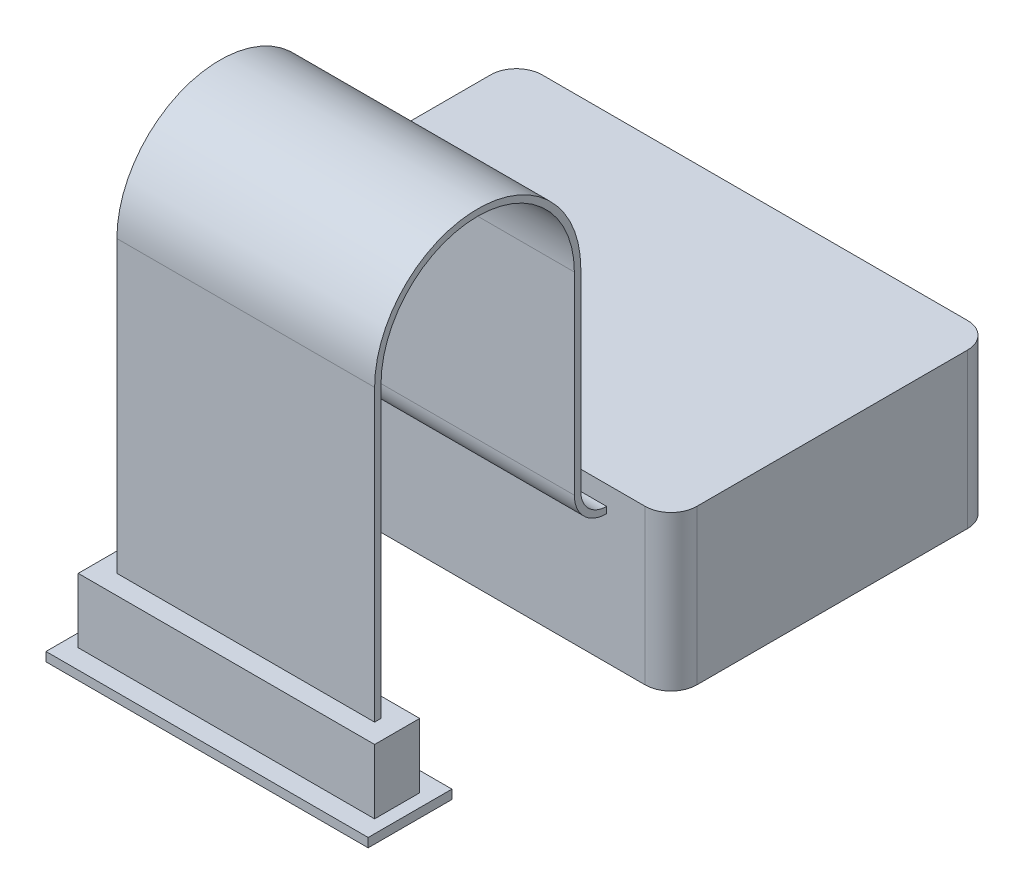
ISO-10303-21;
HEADER;
FILE_DESCRIPTION(('STEP AP214'),'2;1');
FILE_NAME('part.step','',(''),(''),'','','');
FILE_SCHEMA(('AUTOMOTIVE_DESIGN { 1 0 10303 214 1 1 1 1 }'));
ENDSEC;
DATA;
#1=APPLICATION_CONTEXT('core data for automotive mechanical design processes');
#2=APPLICATION_PROTOCOL_DEFINITION('international standard','automotive_design',2000,#1);
#3=PRODUCT_CONTEXT('',#1,'mechanical');
#4=PRODUCT('Part','Part','',(#3));
#5=PRODUCT_RELATED_PRODUCT_CATEGORY('part','',(#4));
#6=PRODUCT_DEFINITION_FORMATION('','',#4);
#7=PRODUCT_DEFINITION_CONTEXT('part definition',#1,'design');
#8=PRODUCT_DEFINITION('design','',#6,#7);
#9=PRODUCT_DEFINITION_SHAPE('','',#8);
#10=(LENGTH_UNIT() NAMED_UNIT(*) SI_UNIT(.MILLI.,.METRE.));
#11=(NAMED_UNIT(*) PLANE_ANGLE_UNIT() SI_UNIT($,.RADIAN.));
#12=(NAMED_UNIT(*) SI_UNIT($,.STERADIAN.) SOLID_ANGLE_UNIT());
#13=UNCERTAINTY_MEASURE_WITH_UNIT(LENGTH_MEASURE(1.E-05),#10,'distance_accuracy_value','');
#14=(GEOMETRIC_REPRESENTATION_CONTEXT(3) GLOBAL_UNCERTAINTY_ASSIGNED_CONTEXT((#13)) GLOBAL_UNIT_ASSIGNED_CONTEXT((#10,
#11,#12)) REPRESENTATION_CONTEXT('',''));
#15=CARTESIAN_POINT('',(0.,0.,0.));
#16=DIRECTION('',(0.,0.,1.));
#17=DIRECTION('',(1.,0.,0.));
#18=AXIS2_PLACEMENT_3D('',#15,#16,#17);
#19=CARTESIAN_POINT('',(-46.99,30.48,31.75));
#20=DIRECTION('',(0.,0.,-1.));
#21=DIRECTION('',(-1.,0.,0.));
#22=AXIS2_PLACEMENT_3D('',#19,#20,#21);
#23=PLANE('',#22);
#24=DIRECTION('',(1.,0.,0.));
#25=VECTOR('',#24,1.);
#26=CARTESIAN_POINT('',(-46.99,0.,31.75));
#27=LINE('',#26,#25);
#28=CARTESIAN_POINT('',(-41.91,0.,31.75));
#29=VERTEX_POINT('',#28);
#30=CARTESIAN_POINT('',(41.91,0.,31.75));
#31=VERTEX_POINT('',#30);
#32=EDGE_CURVE('E349',#29,#31,#27,.T.);
#33=ORIENTED_EDGE('',*,*,#32,.T.);
#34=DIRECTION('',(0.,-1.,0.));
#35=VECTOR('',#34,1.);
#36=CARTESIAN_POINT('',(41.91,30.48,31.75));
#37=LINE('',#36,#35);
#38=CARTESIAN_POINT('',(41.91,30.48,31.75));
#39=VERTEX_POINT('',#38);
#40=EDGE_CURVE('E43',#31,#39,#37,.F.);
#41=ORIENTED_EDGE('',*,*,#40,.T.);
#42=DIRECTION('',(1.,0.,0.));
#43=VECTOR('',#42,1.);
#44=CARTESIAN_POINT('',(-46.99,30.48,31.75));
#45=LINE('',#44,#43);
#46=CARTESIAN_POINT('',(-41.91,30.48,31.75));
#47=VERTEX_POINT('',#46);
#48=EDGE_CURVE('E355',#47,#39,#45,.T.);
#49=ORIENTED_EDGE('',*,*,#48,.F.);
#50=DIRECTION('',(0.,-1.,0.));
#51=VECTOR('',#50,1.);
#52=CARTESIAN_POINT('',(-41.91,30.48,31.75));
#53=LINE('',#52,#51);
#54=EDGE_CURVE('E399',#47,#29,#53,.T.);
#55=ORIENTED_EDGE('',*,*,#54,.T.);
#56=EDGE_LOOP('',(#33,#41,#49,#55));
#57=FACE_BOUND('',#56,.T.);
#58=DIRECTION('',(0.,1.,0.));
#59=VECTOR('',#58,1.);
#60=CARTESIAN_POINT('',(-16.51,26.67,31.75));
#61=LINE('',#60,#59);
#62=CARTESIAN_POINT('',(-16.51,25.4,31.75));
#63=VERTEX_POINT('',#62);
#64=CARTESIAN_POINT('',(-16.51,26.67,31.75));
#65=VERTEX_POINT('',#64);
#66=EDGE_CURVE('E280',#63,#65,#61,.T.);
#67=ORIENTED_EDGE('',*,*,#66,.T.);
#68=DIRECTION('',(1.,0.,0.));
#69=VECTOR('',#68,1.);
#70=CARTESIAN_POINT('',(-16.51,26.67,31.75));
#71=LINE('',#70,#69);
#72=CARTESIAN_POINT('',(34.29,26.67,31.75));
#73=VERTEX_POINT('',#72);
#74=EDGE_CURVE('E340',#65,#73,#71,.T.);
#75=ORIENTED_EDGE('',*,*,#74,.T.);
#76=DIRECTION('',(0.,1.,0.));
#77=VECTOR('',#76,1.);
#78=CARTESIAN_POINT('',(34.29,26.67,31.75));
#79=LINE('',#78,#77);
#80=CARTESIAN_POINT('',(34.29,25.4,31.75));
#81=VERTEX_POINT('',#80);
#82=EDGE_CURVE('E305',#81,#73,#79,.T.);
#83=ORIENTED_EDGE('',*,*,#82,.F.);
#84=DIRECTION('',(1.,0.,0.));
#85=VECTOR('',#84,1.);
#86=CARTESIAN_POINT('',(-16.51,25.4,31.75));
#87=LINE('',#86,#85);
#88=EDGE_CURVE('E303',#63,#81,#87,.T.);
#89=ORIENTED_EDGE('',*,*,#88,.F.);
#90=EDGE_LOOP('',(#67,#75,#83,#89));
#91=FACE_BOUND('',#90,.T.);
#92=ADVANCED_FACE('F35',(#57,#91),#23,.F.);
#93=CARTESIAN_POINT('',(46.99,30.48,-31.75));
#94=DIRECTION('',(-1.,0.,0.));
#95=DIRECTION('',(0.,0.,1.));
#96=AXIS2_PLACEMENT_3D('',#93,#94,#95);
#97=PLANE('',#96);
#98=DIRECTION('',(0.,0.,-1.));
#99=VECTOR('',#98,1.);
#100=CARTESIAN_POINT('',(46.99,0.,-31.75));
#101=LINE('',#100,#99);
#102=CARTESIAN_POINT('',(46.99,0.,26.67));
#103=VERTEX_POINT('',#102);
#104=CARTESIAN_POINT('',(46.99,0.,-26.67));
#105=VERTEX_POINT('',#104);
#106=EDGE_CURVE('E328',#103,#105,#101,.T.);
#107=ORIENTED_EDGE('',*,*,#106,.T.);
#108=DIRECTION('',(0.,-1.,0.));
#109=VECTOR('',#108,1.);
#110=CARTESIAN_POINT('',(46.99,30.48,-26.67));
#111=LINE('',#110,#109);
#112=CARTESIAN_POINT('',(46.99,30.48,-26.67));
#113=VERTEX_POINT('',#112);
#114=EDGE_CURVE('E397',#105,#113,#111,.F.);
#115=ORIENTED_EDGE('',*,*,#114,.T.);
#116=DIRECTION('',(0.,0.,-1.));
#117=VECTOR('',#116,1.);
#118=CARTESIAN_POINT('',(46.99,30.48,-31.75));
#119=LINE('',#118,#117);
#120=CARTESIAN_POINT('',(46.99,30.48,26.67));
#121=VERTEX_POINT('',#120);
#122=EDGE_CURVE('E345',#121,#113,#119,.T.);
#123=ORIENTED_EDGE('',*,*,#122,.F.);
#124=DIRECTION('',(0.,-1.,0.));
#125=VECTOR('',#124,1.);
#126=CARTESIAN_POINT('',(46.99,30.48,26.67));
#127=LINE('',#126,#125);
#128=EDGE_CURVE('E394',#121,#103,#127,.T.);
#129=ORIENTED_EDGE('',*,*,#128,.T.);
#130=EDGE_LOOP('',(#107,#115,#123,#129));
#131=FACE_BOUND('',#130,.T.);
#132=ADVANCED_FACE('F417',(#131),#97,.F.);
#133=CARTESIAN_POINT('',(-46.99,30.48,-31.75));
#134=DIRECTION('',(0.,0.,1.));
#135=DIRECTION('',(1.,0.,0.));
#136=AXIS2_PLACEMENT_3D('',#133,#134,#135);
#137=PLANE('',#136);
#138=DIRECTION('',(-1.,0.,0.));
#139=VECTOR('',#138,1.);
#140=CARTESIAN_POINT('',(-46.99,0.,-31.75));
#141=LINE('',#140,#139);
#142=CARTESIAN_POINT('',(41.91,0.,-31.75));
#143=VERTEX_POINT('',#142);
#144=CARTESIAN_POINT('',(-41.91,0.,-31.75));
#145=VERTEX_POINT('',#144);
#146=EDGE_CURVE('E361',#143,#145,#141,.T.);
#147=ORIENTED_EDGE('',*,*,#146,.T.);
#148=DIRECTION('',(0.,-1.,0.));
#149=VECTOR('',#148,1.);
#150=CARTESIAN_POINT('',(-41.91,30.48,-31.75));
#151=LINE('',#150,#149);
#152=CARTESIAN_POINT('',(-41.91,30.48,-31.75));
#153=VERTEX_POINT('',#152);
#154=EDGE_CURVE('E384',#145,#153,#151,.F.);
#155=ORIENTED_EDGE('',*,*,#154,.T.);
#156=DIRECTION('',(-1.,0.,0.));
#157=VECTOR('',#156,1.);
#158=CARTESIAN_POINT('',(-46.99,30.48,-31.75));
#159=LINE('',#158,#157);
#160=CARTESIAN_POINT('',(41.91,30.48,-31.75));
#161=VERTEX_POINT('',#160);
#162=EDGE_CURVE('E348',#161,#153,#159,.T.);
#163=ORIENTED_EDGE('',*,*,#162,.F.);
#164=DIRECTION('',(0.,-1.,0.));
#165=VECTOR('',#164,1.);
#166=CARTESIAN_POINT('',(41.91,30.48,-31.75));
#167=LINE('',#166,#165);
#168=EDGE_CURVE('E381',#161,#143,#167,.T.);
#169=ORIENTED_EDGE('',*,*,#168,.T.);
#170=EDGE_LOOP('',(#147,#155,#163,#169));
#171=FACE_BOUND('',#170,.T.);
#172=ADVANCED_FACE('F429',(#171),#137,.F.);
#173=CARTESIAN_POINT('',(-46.99,30.48,-31.75));
#174=DIRECTION('',(1.,0.,0.));
#175=DIRECTION('',(0.,0.,-1.));
#176=AXIS2_PLACEMENT_3D('',#173,#174,#175);
#177=PLANE('',#176);
#178=DIRECTION('',(0.,0.,1.));
#179=VECTOR('',#178,1.);
#180=CARTESIAN_POINT('',(-46.99,30.48,-31.75));
#181=LINE('',#180,#179);
#182=CARTESIAN_POINT('',(-46.99,30.48,-26.67));
#183=VERTEX_POINT('',#182);
#184=CARTESIAN_POINT('',(-46.99,30.48,26.67));
#185=VERTEX_POINT('',#184);
#186=EDGE_CURVE('E352',#183,#185,#181,.T.);
#187=ORIENTED_EDGE('',*,*,#186,.F.);
#188=DIRECTION('',(0.,-1.,0.));
#189=VECTOR('',#188,1.);
#190=CARTESIAN_POINT('',(-46.99,30.48,-26.67));
#191=LINE('',#190,#189);
#192=CARTESIAN_POINT('',(-46.99,0.,-26.67));
#193=VERTEX_POINT('',#192);
#194=EDGE_CURVE('E370',#183,#193,#191,.T.);
#195=ORIENTED_EDGE('',*,*,#194,.T.);
#196=DIRECTION('',(0.,0.,1.));
#197=VECTOR('',#196,1.);
#198=CARTESIAN_POINT('',(-46.99,0.,-31.75));
#199=LINE('',#198,#197);
#200=CARTESIAN_POINT('',(-46.99,0.,26.67));
#201=VERTEX_POINT('',#200);
#202=EDGE_CURVE('E364',#193,#201,#199,.T.);
#203=ORIENTED_EDGE('',*,*,#202,.T.);
#204=DIRECTION('',(0.,-1.,0.));
#205=VECTOR('',#204,1.);
#206=CARTESIAN_POINT('',(-46.99,30.48,26.67));
#207=LINE('',#206,#205);
#208=EDGE_CURVE('E358',#201,#185,#207,.F.);
#209=ORIENTED_EDGE('',*,*,#208,.T.);
#210=EDGE_LOOP('',(#187,#195,#203,#209));
#211=FACE_BOUND('',#210,.T.);
#212=ADVANCED_FACE('F437',(#211),#177,.F.);
#213=CARTESIAN_POINT('',(0.,30.48,0.));
#214=DIRECTION('',(0.,1.,0.));
#215=DIRECTION('',(0.,0.,1.));
#216=AXIS2_PLACEMENT_3D('',#213,#214,#215);
#217=PLANE('',#216);
#218=ORIENTED_EDGE('',*,*,#162,.T.);
#219=CARTESIAN_POINT('',(-41.91,30.48,-26.67));
#220=DIRECTION('',(0.,1.,0.));
#221=DIRECTION('',(0.,0.,1.));
#222=AXIS2_PLACEMENT_3D('',#219,#220,#221);
#223=CIRCLE('',#222,5.08);
#224=EDGE_CURVE('E392',#153,#183,#223,.T.);
#225=ORIENTED_EDGE('',*,*,#224,.T.);
#226=ORIENTED_EDGE('',*,*,#186,.T.);
#227=CARTESIAN_POINT('',(-41.91,30.48,26.67));
#228=DIRECTION('',(0.,1.,0.));
#229=DIRECTION('',(0.,0.,1.));
#230=AXIS2_PLACEMENT_3D('',#227,#228,#229);
#231=CIRCLE('',#230,5.08);
#232=EDGE_CURVE('E386',#185,#47,#231,.T.);
#233=ORIENTED_EDGE('',*,*,#232,.T.);
#234=ORIENTED_EDGE('',*,*,#48,.T.);
#235=CARTESIAN_POINT('',(41.91,30.48,26.67));
#236=DIRECTION('',(0.,1.,0.));
#237=DIRECTION('',(0.,0.,1.));
#238=AXIS2_PLACEMENT_3D('',#235,#236,#237);
#239=CIRCLE('',#238,5.08);
#240=EDGE_CURVE('E388',#39,#121,#239,.T.);
#241=ORIENTED_EDGE('',*,*,#240,.T.);
#242=ORIENTED_EDGE('',*,*,#122,.T.);
#243=CARTESIAN_POINT('',(41.91,30.48,-26.67));
#244=DIRECTION('',(0.,1.,0.));
#245=DIRECTION('',(0.,0.,1.));
#246=AXIS2_PLACEMENT_3D('',#243,#244,#245);
#247=CIRCLE('',#246,5.08);
#248=EDGE_CURVE('E390',#113,#161,#247,.T.);
#249=ORIENTED_EDGE('',*,*,#248,.T.);
#250=EDGE_LOOP('',(#218,#225,#226,#233,#234,#241,#242,#249));
#251=FACE_BOUND('',#250,.T.);
#252=ADVANCED_FACE('F410',(#251),#217,.T.);
#253=CARTESIAN_POINT('',(0.,0.,0.));
#254=DIRECTION('',(0.,1.,0.));
#255=DIRECTION('',(0.,0.,1.));
#256=AXIS2_PLACEMENT_3D('',#253,#254,#255);
#257=PLANE('',#256);
#258=ORIENTED_EDGE('',*,*,#202,.F.);
#259=CARTESIAN_POINT('',(-41.91,0.,-26.67));
#260=DIRECTION('',(0.,1.,0.));
#261=DIRECTION('',(0.,0.,1.));
#262=AXIS2_PLACEMENT_3D('',#259,#260,#261);
#263=CIRCLE('',#262,5.08);
#264=EDGE_CURVE('E379',#193,#145,#263,.F.);
#265=ORIENTED_EDGE('',*,*,#264,.T.);
#266=ORIENTED_EDGE('',*,*,#146,.F.);
#267=CARTESIAN_POINT('',(41.91,0.,-26.67));
#268=DIRECTION('',(0.,1.,0.));
#269=DIRECTION('',(0.,0.,1.));
#270=AXIS2_PLACEMENT_3D('',#267,#268,#269);
#271=CIRCLE('',#270,5.08);
#272=EDGE_CURVE('E377',#143,#105,#271,.F.);
#273=ORIENTED_EDGE('',*,*,#272,.T.);
#274=ORIENTED_EDGE('',*,*,#106,.F.);
#275=CARTESIAN_POINT('',(41.91,0.,26.67));
#276=DIRECTION('',(0.,1.,0.));
#277=DIRECTION('',(0.,0.,1.));
#278=AXIS2_PLACEMENT_3D('',#275,#276,#277);
#279=CIRCLE('',#278,5.08);
#280=EDGE_CURVE('E375',#103,#31,#279,.F.);
#281=ORIENTED_EDGE('',*,*,#280,.T.);
#282=ORIENTED_EDGE('',*,*,#32,.F.);
#283=CARTESIAN_POINT('',(-41.91,0.,26.67));
#284=DIRECTION('',(0.,1.,0.));
#285=DIRECTION('',(0.,0.,1.));
#286=AXIS2_PLACEMENT_3D('',#283,#284,#285);
#287=CIRCLE('',#286,5.08);
#288=EDGE_CURVE('E373',#29,#201,#287,.F.);
#289=ORIENTED_EDGE('',*,*,#288,.T.);
#290=EDGE_LOOP('',(#258,#265,#266,#273,#274,#281,#282,#289));
#291=FACE_BOUND('',#290,.T.);
#292=ADVANCED_FACE('F421',(#291),#257,.F.);
#293=CARTESIAN_POINT('',(-41.91,30.48,-26.67));
#294=DIRECTION('',(0.,-1.,0.));
#295=DIRECTION('',(0.,0.,-1.));
#296=AXIS2_PLACEMENT_3D('',#293,#294,#295);
#297=CYLINDRICAL_SURFACE('',#296,5.08);
#298=ORIENTED_EDGE('',*,*,#224,.F.);
#299=ORIENTED_EDGE('',*,*,#154,.F.);
#300=ORIENTED_EDGE('',*,*,#264,.F.);
#301=ORIENTED_EDGE('',*,*,#194,.F.);
#302=EDGE_LOOP('',(#298,#299,#300,#301));
#303=FACE_BOUND('',#302,.T.);
#304=ADVANCED_FACE('F435',(#303),#297,.T.);
#305=CARTESIAN_POINT('',(41.91,30.48,-26.67));
#306=DIRECTION('',(0.,-1.,0.));
#307=DIRECTION('',(0.,0.,-1.));
#308=AXIS2_PLACEMENT_3D('',#305,#306,#307);
#309=CYLINDRICAL_SURFACE('',#308,5.08);
#310=ORIENTED_EDGE('',*,*,#248,.F.);
#311=ORIENTED_EDGE('',*,*,#114,.F.);
#312=ORIENTED_EDGE('',*,*,#272,.F.);
#313=ORIENTED_EDGE('',*,*,#168,.F.);
#314=EDGE_LOOP('',(#310,#311,#312,#313));
#315=FACE_BOUND('',#314,.T.);
#316=ADVANCED_FACE('F426',(#315),#309,.T.);
#317=CARTESIAN_POINT('',(41.91,30.48,26.67));
#318=DIRECTION('',(0.,-1.,0.));
#319=DIRECTION('',(0.,0.,-1.));
#320=AXIS2_PLACEMENT_3D('',#317,#318,#319);
#321=CYLINDRICAL_SURFACE('',#320,5.08);
#322=ORIENTED_EDGE('',*,*,#240,.F.);
#323=ORIENTED_EDGE('',*,*,#40,.F.);
#324=ORIENTED_EDGE('',*,*,#280,.F.);
#325=ORIENTED_EDGE('',*,*,#128,.F.);
#326=EDGE_LOOP('',(#322,#323,#324,#325));
#327=FACE_BOUND('',#326,.T.);
#328=ADVANCED_FACE('F414',(#327),#321,.T.);
#329=CARTESIAN_POINT('',(-41.91,30.48,26.67));
#330=DIRECTION('',(0.,-1.,0.));
#331=DIRECTION('',(0.,0.,-1.));
#332=AXIS2_PLACEMENT_3D('',#329,#330,#331);
#333=CYLINDRICAL_SURFACE('',#332,5.08);
#334=ORIENTED_EDGE('',*,*,#232,.F.);
#335=ORIENTED_EDGE('',*,*,#208,.F.);
#336=ORIENTED_EDGE('',*,*,#288,.F.);
#337=ORIENTED_EDGE('',*,*,#54,.F.);
#338=EDGE_LOOP('',(#334,#335,#336,#337));
#339=FACE_BOUND('',#338,.T.);
#340=ADVANCED_FACE('F37',(#339),#333,.T.);
#341=CARTESIAN_POINT('',(-16.51,31.75,31.75));
#342=DIRECTION('',(1.,0.,0.));
#343=DIRECTION('',(0.,0.,-1.));
#344=AXIS2_PLACEMENT_3D('',#341,#342,#343);
#345=CYLINDRICAL_SURFACE('',#344,6.35);
#346=CARTESIAN_POINT('',(34.29,31.75,31.75));
#347=DIRECTION('',(1.,0.,0.));
#348=DIRECTION('',(0.,0.,-1.));
#349=AXIS2_PLACEMENT_3D('',#346,#347,#348);
#350=CIRCLE('',#349,6.35);
#351=CARTESIAN_POINT('',(34.29,31.75,38.1));
#352=VERTEX_POINT('',#351);
#353=EDGE_CURVE('E276',#352,#81,#350,.T.);
#354=ORIENTED_EDGE('',*,*,#353,.F.);
#355=DIRECTION('',(1.,0.,0.));
#356=VECTOR('',#355,1.);
#357=CARTESIAN_POINT('',(-16.51,31.75,38.1));
#358=LINE('',#357,#356);
#359=CARTESIAN_POINT('',(-16.51,31.75,38.1));
#360=VERTEX_POINT('',#359);
#361=EDGE_CURVE('E326',#360,#352,#358,.T.);
#362=ORIENTED_EDGE('',*,*,#361,.F.);
#363=CARTESIAN_POINT('',(-16.51,31.75,31.75));
#364=DIRECTION('',(1.,0.,0.));
#365=DIRECTION('',(0.,0.,-1.));
#366=AXIS2_PLACEMENT_3D('',#363,#364,#365);
#367=CIRCLE('',#366,6.35);
#368=EDGE_CURVE('E277',#360,#63,#367,.T.);
#369=ORIENTED_EDGE('',*,*,#368,.T.);
#370=ORIENTED_EDGE('',*,*,#88,.T.);
#371=EDGE_LOOP('',(#354,#362,#369,#370));
#372=FACE_BOUND('',#371,.T.);
#373=ADVANCED_FACE('F441',(#372),#345,.T.);
#374=CARTESIAN_POINT('',(-16.51,31.75,38.1));
#375=DIRECTION('',(0.,0.,1.));
#376=DIRECTION('',(0.,-1.,0.));
#377=AXIS2_PLACEMENT_3D('',#374,#375,#376);
#378=PLANE('',#377);
#379=DIRECTION('',(0.,-1.,0.));
#380=VECTOR('',#379,1.);
#381=CARTESIAN_POINT('',(34.29,31.75,38.1));
#382=LINE('',#381,#380);
#383=CARTESIAN_POINT('',(34.29,69.85,38.1));
#384=VERTEX_POINT('',#383);
#385=EDGE_CURVE('E281',#384,#352,#382,.T.);
#386=ORIENTED_EDGE('',*,*,#385,.F.);
#387=DIRECTION('',(1.,0.,0.));
#388=VECTOR('',#387,1.);
#389=CARTESIAN_POINT('',(-16.51,69.85,38.1));
#390=LINE('',#389,#388);
#391=CARTESIAN_POINT('',(-16.51,69.85,38.1));
#392=VERTEX_POINT('',#391);
#393=EDGE_CURVE('E329',#392,#384,#390,.T.);
#394=ORIENTED_EDGE('',*,*,#393,.F.);
#395=DIRECTION('',(0.,-1.,0.));
#396=VECTOR('',#395,1.);
#397=CARTESIAN_POINT('',(-16.51,31.75,38.1));
#398=LINE('',#397,#396);
#399=EDGE_CURVE('E300',#392,#360,#398,.T.);
#400=ORIENTED_EDGE('',*,*,#399,.T.);
#401=ORIENTED_EDGE('',*,*,#361,.T.);
#402=EDGE_LOOP('',(#386,#394,#400,#401));
#403=FACE_BOUND('',#402,.T.);
#404=ADVANCED_FACE('F446',(#403),#378,.T.);
#405=CARTESIAN_POINT('',(-16.51,69.85,57.15));
#406=DIRECTION('',(1.,0.,0.));
#407=DIRECTION('',(0.,0.,-1.));
#408=AXIS2_PLACEMENT_3D('',#405,#406,#407);
#409=CYLINDRICAL_SURFACE('',#408,19.05);
#410=CARTESIAN_POINT('',(34.29,69.85,57.15));
#411=DIRECTION('',(-1.,0.,0.));
#412=DIRECTION('',(0.,0.,-1.));
#413=AXIS2_PLACEMENT_3D('',#410,#411,#412);
#414=CIRCLE('',#413,19.05);
#415=CARTESIAN_POINT('',(34.29,69.85,76.2));
#416=VERTEX_POINT('',#415);
#417=EDGE_CURVE('E321',#416,#384,#414,.T.);
#418=ORIENTED_EDGE('',*,*,#417,.F.);
#419=DIRECTION('',(1.,0.,0.));
#420=VECTOR('',#419,1.);
#421=CARTESIAN_POINT('',(-16.51,69.85,76.2));
#422=LINE('',#421,#420);
#423=CARTESIAN_POINT('',(-16.51,69.85,76.2));
#424=VERTEX_POINT('',#423);
#425=EDGE_CURVE('E331',#424,#416,#422,.T.);
#426=ORIENTED_EDGE('',*,*,#425,.F.);
#427=CARTESIAN_POINT('',(-16.51,69.85,57.15));
#428=DIRECTION('',(-1.,0.,0.));
#429=DIRECTION('',(0.,0.,-1.));
#430=AXIS2_PLACEMENT_3D('',#427,#428,#429);
#431=CIRCLE('',#430,19.05);
#432=EDGE_CURVE('E297',#424,#392,#431,.T.);
#433=ORIENTED_EDGE('',*,*,#432,.T.);
#434=ORIENTED_EDGE('',*,*,#393,.T.);
#435=EDGE_LOOP('',(#418,#426,#433,#434));
#436=FACE_BOUND('',#435,.T.);
#437=ADVANCED_FACE('F497',(#436),#409,.F.);
#438=CARTESIAN_POINT('',(-16.51,69.85,76.2));
#439=DIRECTION('',(0.,0.,-1.));
#440=DIRECTION('',(-1.,0.,0.));
#441=AXIS2_PLACEMENT_3D('',#438,#439,#440);
#442=PLANE('',#441);
#443=DIRECTION('',(1.,0.,0.));
#444=VECTOR('',#443,1.);
#445=CARTESIAN_POINT('',(-16.51,12.7,76.2));
#446=LINE('',#445,#444);
#447=CARTESIAN_POINT('',(-16.51,12.7,76.2));
#448=VERTEX_POINT('',#447);
#449=CARTESIAN_POINT('',(34.29,12.7,76.2));
#450=VERTEX_POINT('',#449);
#451=EDGE_CURVE('E58',#448,#450,#446,.T.);
#452=ORIENTED_EDGE('',*,*,#451,.F.);
#453=DIRECTION('',(0.,1.,0.));
#454=VECTOR('',#453,1.);
#455=CARTESIAN_POINT('',(-16.51,69.85,76.2));
#456=LINE('',#455,#454);
#457=EDGE_CURVE('E295',#448,#424,#456,.T.);
#458=ORIENTED_EDGE('',*,*,#457,.T.);
#459=ORIENTED_EDGE('',*,*,#425,.T.);
#460=DIRECTION('',(0.,1.,0.));
#461=VECTOR('',#460,1.);
#462=CARTESIAN_POINT('',(34.29,69.85,76.2));
#463=LINE('',#462,#461);
#464=EDGE_CURVE('E319',#450,#416,#463,.T.);
#465=ORIENTED_EDGE('',*,*,#464,.F.);
#466=EDGE_LOOP('',(#452,#458,#459,#465));
#467=FACE_BOUND('',#466,.T.);
#468=ADVANCED_FACE('F507',(#467),#442,.T.);
#469=CARTESIAN_POINT('',(-16.51,0.,77.47));
#470=DIRECTION('',(0.,0.,1.));
#471=DIRECTION('',(1.,0.,0.));
#472=AXIS2_PLACEMENT_3D('',#469,#470,#471);
#473=PLANE('',#472);
#474=DIRECTION('',(-1.,0.,0.));
#475=VECTOR('',#474,1.);
#476=CARTESIAN_POINT('',(-16.51,12.7,77.47));
#477=LINE('',#476,#475);
#478=CARTESIAN_POINT('',(34.29,12.7,77.47));
#479=VERTEX_POINT('',#478);
#480=CARTESIAN_POINT('',(-16.51,12.7,77.47));
#481=VERTEX_POINT('',#480);
#482=EDGE_CURVE('E236',#479,#481,#477,.T.);
#483=ORIENTED_EDGE('',*,*,#482,.F.);
#484=DIRECTION('',(0.,-1.,0.));
#485=VECTOR('',#484,1.);
#486=CARTESIAN_POINT('',(34.29,0.,77.47));
#487=LINE('',#486,#485);
#488=CARTESIAN_POINT('',(34.29,69.85,77.47));
#489=VERTEX_POINT('',#488);
#490=EDGE_CURVE('E317',#489,#479,#487,.T.);
#491=ORIENTED_EDGE('',*,*,#490,.F.);
#492=DIRECTION('',(1.,0.,0.));
#493=VECTOR('',#492,1.);
#494=CARTESIAN_POINT('',(-16.51,69.85,77.47));
#495=LINE('',#494,#493);
#496=CARTESIAN_POINT('',(-16.51,69.85,77.47));
#497=VERTEX_POINT('',#496);
#498=EDGE_CURVE('E334',#497,#489,#495,.T.);
#499=ORIENTED_EDGE('',*,*,#498,.F.);
#500=DIRECTION('',(0.,-1.,0.));
#501=VECTOR('',#500,1.);
#502=CARTESIAN_POINT('',(-16.51,0.,77.47));
#503=LINE('',#502,#501);
#504=EDGE_CURVE('E293',#497,#481,#503,.T.);
#505=ORIENTED_EDGE('',*,*,#504,.T.);
#506=EDGE_LOOP('',(#483,#491,#499,#505));
#507=FACE_BOUND('',#506,.T.);
#508=ADVANCED_FACE('F521',(#507),#473,.T.);
#509=CARTESIAN_POINT('',(-16.51,69.85,57.15));
#510=DIRECTION('',(1.,0.,0.));
#511=DIRECTION('',(0.,0.,-1.));
#512=AXIS2_PLACEMENT_3D('',#509,#510,#511);
#513=CYLINDRICAL_SURFACE('',#512,20.32);
#514=CARTESIAN_POINT('',(34.29,69.85,57.15));
#515=DIRECTION('',(1.,0.,0.));
#516=DIRECTION('',(0.,0.,-1.));
#517=AXIS2_PLACEMENT_3D('',#514,#515,#516);
#518=CIRCLE('',#517,20.32);
#519=CARTESIAN_POINT('',(34.29,69.85,36.83));
#520=VERTEX_POINT('',#519);
#521=EDGE_CURVE('E314',#520,#489,#518,.T.);
#522=ORIENTED_EDGE('',*,*,#521,.F.);
#523=DIRECTION('',(1.,0.,0.));
#524=VECTOR('',#523,1.);
#525=CARTESIAN_POINT('',(-16.51,69.85,36.83));
#526=LINE('',#525,#524);
#527=CARTESIAN_POINT('',(-16.51,69.85,36.83));
#528=VERTEX_POINT('',#527);
#529=EDGE_CURVE('E336',#528,#520,#526,.T.);
#530=ORIENTED_EDGE('',*,*,#529,.F.);
#531=CARTESIAN_POINT('',(-16.51,69.85,57.15));
#532=DIRECTION('',(1.,0.,0.));
#533=DIRECTION('',(0.,0.,-1.));
#534=AXIS2_PLACEMENT_3D('',#531,#532,#533);
#535=CIRCLE('',#534,20.32);
#536=EDGE_CURVE('E290',#528,#497,#535,.T.);
#537=ORIENTED_EDGE('',*,*,#536,.T.);
#538=ORIENTED_EDGE('',*,*,#498,.T.);
#539=EDGE_LOOP('',(#522,#530,#537,#538));
#540=FACE_BOUND('',#539,.T.);
#541=ADVANCED_FACE('F515',(#540),#513,.T.);
#542=CARTESIAN_POINT('',(-16.51,69.85,36.83));
#543=DIRECTION('',(0.,0.,-1.));
#544=DIRECTION('',(0.,1.,0.));
#545=AXIS2_PLACEMENT_3D('',#542,#543,#544);
#546=PLANE('',#545);
#547=DIRECTION('',(0.,1.,0.));
#548=VECTOR('',#547,1.);
#549=CARTESIAN_POINT('',(34.29,69.85,36.83));
#550=LINE('',#549,#548);
#551=CARTESIAN_POINT('',(34.29,31.75,36.83));
#552=VERTEX_POINT('',#551);
#553=EDGE_CURVE('E311',#552,#520,#550,.T.);
#554=ORIENTED_EDGE('',*,*,#553,.F.);
#555=DIRECTION('',(1.,0.,0.));
#556=VECTOR('',#555,1.);
#557=CARTESIAN_POINT('',(-16.51,31.75,36.83));
#558=LINE('',#557,#556);
#559=CARTESIAN_POINT('',(-16.51,31.75,36.83));
#560=VERTEX_POINT('',#559);
#561=EDGE_CURVE('E338',#560,#552,#558,.T.);
#562=ORIENTED_EDGE('',*,*,#561,.F.);
#563=DIRECTION('',(0.,1.,0.));
#564=VECTOR('',#563,1.);
#565=CARTESIAN_POINT('',(-16.51,69.85,36.83));
#566=LINE('',#565,#564);
#567=EDGE_CURVE('E287',#560,#528,#566,.T.);
#568=ORIENTED_EDGE('',*,*,#567,.T.);
#569=ORIENTED_EDGE('',*,*,#529,.T.);
#570=EDGE_LOOP('',(#554,#562,#568,#569));
#571=FACE_BOUND('',#570,.T.);
#572=ADVANCED_FACE('F520',(#571),#546,.T.);
#573=CARTESIAN_POINT('',(-16.51,31.75,31.75));
#574=DIRECTION('',(1.,0.,0.));
#575=DIRECTION('',(0.,0.,-1.));
#576=AXIS2_PLACEMENT_3D('',#573,#574,#575);
#577=CYLINDRICAL_SURFACE('',#576,5.08);
#578=CARTESIAN_POINT('',(34.29,31.75,31.75));
#579=DIRECTION('',(-1.,0.,0.));
#580=DIRECTION('',(0.,0.,-1.));
#581=AXIS2_PLACEMENT_3D('',#578,#579,#580);
#582=CIRCLE('',#581,5.08);
#583=EDGE_CURVE('E308',#73,#552,#582,.T.);
#584=ORIENTED_EDGE('',*,*,#583,.F.);
#585=ORIENTED_EDGE('',*,*,#74,.F.);
#586=CARTESIAN_POINT('',(-16.51,31.75,31.75));
#587=DIRECTION('',(-1.,0.,0.));
#588=DIRECTION('',(0.,0.,-1.));
#589=AXIS2_PLACEMENT_3D('',#586,#587,#588);
#590=CIRCLE('',#589,5.08);
#591=EDGE_CURVE('E284',#65,#560,#590,.T.);
#592=ORIENTED_EDGE('',*,*,#591,.T.);
#593=ORIENTED_EDGE('',*,*,#561,.T.);
#594=EDGE_LOOP('',(#584,#585,#592,#593));
#595=FACE_BOUND('',#594,.T.);
#596=ADVANCED_FACE('F533',(#595),#577,.F.);
#597=CARTESIAN_POINT('',(-16.51,31.75,31.75));
#598=DIRECTION('',(1.,0.,0.));
#599=DIRECTION('',(0.,0.,-1.));
#600=AXIS2_PLACEMENT_3D('',#597,#598,#599);
#601=PLANE('',#600);
#602=ORIENTED_EDGE('',*,*,#457,.F.);
#603=DIRECTION('',(0.,0.,1.));
#604=VECTOR('',#603,1.);
#605=CARTESIAN_POINT('',(-16.51,12.7,31.75));
#606=LINE('',#605,#604);
#607=EDGE_CURVE('E50',#448,#481,#606,.T.);
#608=ORIENTED_EDGE('',*,*,#607,.T.);
#609=ORIENTED_EDGE('',*,*,#504,.F.);
#610=ORIENTED_EDGE('',*,*,#536,.F.);
#611=ORIENTED_EDGE('',*,*,#567,.F.);
#612=ORIENTED_EDGE('',*,*,#591,.F.);
#613=ORIENTED_EDGE('',*,*,#66,.F.);
#614=ORIENTED_EDGE('',*,*,#368,.F.);
#615=ORIENTED_EDGE('',*,*,#399,.F.);
#616=ORIENTED_EDGE('',*,*,#432,.F.);
#617=EDGE_LOOP('',(#602,#608,#609,#610,#611,#612,#613,#614,#615,#616));
#618=FACE_BOUND('',#617,.T.);
#619=ADVANCED_FACE('F543',(#618),#601,.F.);
#620=CARTESIAN_POINT('',(34.29,31.75,31.75));
#621=DIRECTION('',(1.,0.,0.));
#622=DIRECTION('',(0.,0.,-1.));
#623=AXIS2_PLACEMENT_3D('',#620,#621,#622);
#624=PLANE('',#623);
#625=DIRECTION('',(0.,0.,1.));
#626=VECTOR('',#625,1.);
#627=CARTESIAN_POINT('',(34.29,12.7,31.75));
#628=LINE('',#627,#626);
#629=EDGE_CURVE('E11',#450,#479,#628,.T.);
#630=ORIENTED_EDGE('',*,*,#629,.F.);
#631=ORIENTED_EDGE('',*,*,#464,.T.);
#632=ORIENTED_EDGE('',*,*,#417,.T.);
#633=ORIENTED_EDGE('',*,*,#385,.T.);
#634=ORIENTED_EDGE('',*,*,#353,.T.);
#635=ORIENTED_EDGE('',*,*,#82,.T.);
#636=ORIENTED_EDGE('',*,*,#583,.T.);
#637=ORIENTED_EDGE('',*,*,#553,.T.);
#638=ORIENTED_EDGE('',*,*,#521,.T.);
#639=ORIENTED_EDGE('',*,*,#490,.T.);
#640=EDGE_LOOP('',(#630,#631,#632,#633,#634,#635,#636,#637,#638,#639));
#641=FACE_BOUND('',#640,.T.);
#642=ADVANCED_FACE('F622',(#641),#624,.T.);
#643=CARTESIAN_POINT('',(0.,12.7,0.));
#644=DIRECTION('',(0.,1.,0.));
#645=DIRECTION('',(0.,0.,1.));
#646=AXIS2_PLACEMENT_3D('',#643,#644,#645);
#647=PLANE('',#646);
#648=DIRECTION('',(0.,0.,-1.));
#649=VECTOR('',#648,1.);
#650=CARTESIAN_POINT('',(38.1,12.7,72.39));
#651=LINE('',#650,#649);
#652=CARTESIAN_POINT('',(38.1,12.7,81.28));
#653=VERTEX_POINT('',#652);
#654=CARTESIAN_POINT('',(38.1,12.7,72.39));
#655=VERTEX_POINT('',#654);
#656=EDGE_CURVE('E222',#653,#655,#651,.T.);
#657=ORIENTED_EDGE('',*,*,#656,.T.);
#658=DIRECTION('',(-1.,0.,0.));
#659=VECTOR('',#658,1.);
#660=CARTESIAN_POINT('',(-20.32,12.7,72.39));
#661=LINE('',#660,#659);
#662=CARTESIAN_POINT('',(-20.32,12.7,72.39));
#663=VERTEX_POINT('',#662);
#664=EDGE_CURVE('E210',#655,#663,#661,.T.);
#665=ORIENTED_EDGE('',*,*,#664,.T.);
#666=DIRECTION('',(0.,0.,1.));
#667=VECTOR('',#666,1.);
#668=CARTESIAN_POINT('',(-20.32,12.7,72.39));
#669=LINE('',#668,#667);
#670=CARTESIAN_POINT('',(-20.32,12.7,81.28));
#671=VERTEX_POINT('',#670);
#672=EDGE_CURVE('E221',#663,#671,#669,.T.);
#673=ORIENTED_EDGE('',*,*,#672,.T.);
#674=DIRECTION('',(1.,0.,0.));
#675=VECTOR('',#674,1.);
#676=CARTESIAN_POINT('',(-20.32,12.7,81.28));
#677=LINE('',#676,#675);
#678=EDGE_CURVE('E228',#671,#653,#677,.T.);
#679=ORIENTED_EDGE('',*,*,#678,.T.);
#680=EDGE_LOOP('',(#657,#665,#673,#679));
#681=FACE_BOUND('',#680,.T.);
#682=ORIENTED_EDGE('',*,*,#607,.F.);
#683=ORIENTED_EDGE('',*,*,#451,.T.);
#684=ORIENTED_EDGE('',*,*,#629,.T.);
#685=ORIENTED_EDGE('',*,*,#482,.T.);
#686=EDGE_LOOP('',(#682,#683,#684,#685));
#687=FACE_BOUND('',#686,.T.);
#688=ADVANCED_FACE('F225',(#681,#687),#647,.T.);
#689=CARTESIAN_POINT('',(38.1,12.7,72.39));
#690=DIRECTION('',(-1.,0.,0.));
#691=DIRECTION('',(0.,0.,1.));
#692=AXIS2_PLACEMENT_3D('',#689,#690,#691);
#693=PLANE('',#692);
#694=DIRECTION('',(0.,0.,-1.));
#695=VECTOR('',#694,1.);
#696=CARTESIAN_POINT('',(38.1,0.,72.39));
#697=LINE('',#696,#695);
#698=CARTESIAN_POINT('',(38.1,0.,81.28));
#699=VERTEX_POINT('',#698);
#700=CARTESIAN_POINT('',(38.1,0.,72.39));
#701=VERTEX_POINT('',#700);
#702=EDGE_CURVE('E235',#699,#701,#697,.T.);
#703=ORIENTED_EDGE('',*,*,#702,.T.);
#704=DIRECTION('',(0.,-1.,0.));
#705=VECTOR('',#704,1.);
#706=CARTESIAN_POINT('',(38.1,12.7,72.39));
#707=LINE('',#706,#705);
#708=EDGE_CURVE('E215',#655,#701,#707,.T.);
#709=ORIENTED_EDGE('',*,*,#708,.F.);
#710=ORIENTED_EDGE('',*,*,#656,.F.);
#711=DIRECTION('',(0.,-1.,0.));
#712=VECTOR('',#711,1.);
#713=CARTESIAN_POINT('',(38.1,12.7,81.28));
#714=LINE('',#713,#712);
#715=EDGE_CURVE('E728',#653,#699,#714,.T.);
#716=ORIENTED_EDGE('',*,*,#715,.T.);
#717=EDGE_LOOP('',(#703,#709,#710,#716));
#718=FACE_BOUND('',#717,.T.);
#719=ADVANCED_FACE('F234',(#718),#693,.F.);
#720=CARTESIAN_POINT('',(-20.32,12.7,72.39));
#721=DIRECTION('',(0.,0.,1.));
#722=DIRECTION('',(0.,-1.,0.));
#723=AXIS2_PLACEMENT_3D('',#720,#721,#722);
#724=PLANE('',#723);
#725=DIRECTION('',(-1.,0.,0.));
#726=VECTOR('',#725,1.);
#727=CARTESIAN_POINT('',(-20.32,0.,72.39));
#728=LINE('',#727,#726);
#729=CARTESIAN_POINT('',(-20.32,0.,72.39));
#730=VERTEX_POINT('',#729);
#731=EDGE_CURVE('E725',#701,#730,#728,.T.);
#732=ORIENTED_EDGE('',*,*,#731,.T.);
#733=DIRECTION('',(0.,-1.,0.));
#734=VECTOR('',#733,1.);
#735=CARTESIAN_POINT('',(-20.32,12.7,72.39));
#736=LINE('',#735,#734);
#737=EDGE_CURVE('E218',#663,#730,#736,.T.);
#738=ORIENTED_EDGE('',*,*,#737,.F.);
#739=ORIENTED_EDGE('',*,*,#664,.F.);
#740=ORIENTED_EDGE('',*,*,#708,.T.);
#741=EDGE_LOOP('',(#732,#738,#739,#740));
#742=FACE_BOUND('',#741,.T.);
#743=ADVANCED_FACE('F213',(#742),#724,.F.);
#744=CARTESIAN_POINT('',(-20.32,12.7,72.39));
#745=DIRECTION('',(1.,0.,0.));
#746=DIRECTION('',(0.,0.,-1.));
#747=AXIS2_PLACEMENT_3D('',#744,#745,#746);
#748=PLANE('',#747);
#749=DIRECTION('',(0.,0.,1.));
#750=VECTOR('',#749,1.);
#751=CARTESIAN_POINT('',(-20.32,0.,72.39));
#752=LINE('',#751,#750);
#753=CARTESIAN_POINT('',(-20.32,0.,81.28));
#754=VERTEX_POINT('',#753);
#755=EDGE_CURVE('E730',#730,#754,#752,.T.);
#756=ORIENTED_EDGE('',*,*,#755,.T.);
#757=DIRECTION('',(0.,-1.,0.));
#758=VECTOR('',#757,1.);
#759=CARTESIAN_POINT('',(-20.32,12.7,81.28));
#760=LINE('',#759,#758);
#761=EDGE_CURVE('E240',#671,#754,#760,.T.);
#762=ORIENTED_EDGE('',*,*,#761,.F.);
#763=ORIENTED_EDGE('',*,*,#672,.F.);
#764=ORIENTED_EDGE('',*,*,#737,.T.);
#765=EDGE_LOOP('',(#756,#762,#763,#764));
#766=FACE_BOUND('',#765,.T.);
#767=ADVANCED_FACE('F655',(#766),#748,.F.);
#768=CARTESIAN_POINT('',(-20.32,12.7,81.28));
#769=DIRECTION('',(0.,0.,-1.));
#770=DIRECTION('',(0.,1.,0.));
#771=AXIS2_PLACEMENT_3D('',#768,#769,#770);
#772=PLANE('',#771);
#773=DIRECTION('',(1.,0.,0.));
#774=VECTOR('',#773,1.);
#775=CARTESIAN_POINT('',(-20.32,0.,81.28));
#776=LINE('',#775,#774);
#777=EDGE_CURVE('E232',#754,#699,#776,.T.);
#778=ORIENTED_EDGE('',*,*,#777,.T.);
#779=ORIENTED_EDGE('',*,*,#715,.F.);
#780=ORIENTED_EDGE('',*,*,#678,.F.);
#781=ORIENTED_EDGE('',*,*,#761,.T.);
#782=EDGE_LOOP('',(#778,#779,#780,#781));
#783=FACE_BOUND('',#782,.T.);
#784=ADVANCED_FACE('F599',(#783),#772,.F.);
#785=CARTESIAN_POINT('',(0.,-1.778,0.));
#786=DIRECTION('',(0.,-1.,0.));
#787=DIRECTION('',(0.,0.,-1.));
#788=AXIS2_PLACEMENT_3D('',#785,#786,#787);
#789=PLANE('',#788);
#790=DIRECTION('',(0.,0.,1.));
#791=VECTOR('',#790,1.);
#792=CARTESIAN_POINT('',(40.64,-1.77800000000001,85.09));
#793=LINE('',#792,#791);
#794=CARTESIAN_POINT('',(40.64,-1.77800000000001,68.58));
#795=VERTEX_POINT('',#794);
#796=CARTESIAN_POINT('',(40.64,-1.77800000000001,85.09));
#797=VERTEX_POINT('',#796);
#798=EDGE_CURVE('E247',#795,#797,#793,.T.);
#799=ORIENTED_EDGE('',*,*,#798,.T.);
#800=DIRECTION('',(-1.,0.,0.));
#801=VECTOR('',#800,1.);
#802=CARTESIAN_POINT('',(-22.86,-1.77800000000001,85.09));
#803=LINE('',#802,#801);
#804=CARTESIAN_POINT('',(-22.86,-1.77800000000001,85.09));
#805=VERTEX_POINT('',#804);
#806=EDGE_CURVE('E250',#797,#805,#803,.T.);
#807=ORIENTED_EDGE('',*,*,#806,.T.);
#808=DIRECTION('',(0.,0.,-1.));
#809=VECTOR('',#808,1.);
#810=CARTESIAN_POINT('',(-22.86,-1.77800000000001,85.09));
#811=LINE('',#810,#809);
#812=CARTESIAN_POINT('',(-22.86,-1.77800000000001,68.58));
#813=VERTEX_POINT('',#812);
#814=EDGE_CURVE('E253',#805,#813,#811,.T.);
#815=ORIENTED_EDGE('',*,*,#814,.T.);
#816=DIRECTION('',(1.,0.,0.));
#817=VECTOR('',#816,1.);
#818=CARTESIAN_POINT('',(-22.86,-1.77800000000001,68.58));
#819=LINE('',#818,#817);
#820=EDGE_CURVE('E255',#813,#795,#819,.T.);
#821=ORIENTED_EDGE('',*,*,#820,.T.);
#822=EDGE_LOOP('',(#799,#807,#815,#821));
#823=FACE_BOUND('',#822,.T.);
#824=ADVANCED_FACE('F572',(#823),#789,.T.);
#825=CARTESIAN_POINT('',(-22.86,-1.77800000000001,85.09));
#826=DIRECTION('',(0.,0.,-1.));
#827=DIRECTION('',(0.,1.,0.));
#828=AXIS2_PLACEMENT_3D('',#825,#826,#827);
#829=PLANE('',#828);
#830=DIRECTION('',(-1.,0.,0.));
#831=VECTOR('',#830,1.);
#832=CARTESIAN_POINT('',(-22.86,0.,85.09));
#833=LINE('',#832,#831);
#834=CARTESIAN_POINT('',(40.64,0.,85.09));
#835=VERTEX_POINT('',#834);
#836=CARTESIAN_POINT('',(-22.86,0.,85.09));
#837=VERTEX_POINT('',#836);
#838=EDGE_CURVE('E260',#835,#837,#833,.T.);
#839=ORIENTED_EDGE('',*,*,#838,.T.);
#840=DIRECTION('',(0.,1.,0.));
#841=VECTOR('',#840,1.);
#842=CARTESIAN_POINT('',(-22.86,-1.77800000000001,85.09));
#843=LINE('',#842,#841);
#844=EDGE_CURVE('E270',#805,#837,#843,.T.);
#845=ORIENTED_EDGE('',*,*,#844,.F.);
#846=ORIENTED_EDGE('',*,*,#806,.F.);
#847=DIRECTION('',(0.,1.,0.));
#848=VECTOR('',#847,1.);
#849=CARTESIAN_POINT('',(40.64,-1.77800000000001,85.09));
#850=LINE('',#849,#848);
#851=EDGE_CURVE('E273',#797,#835,#850,.T.);
#852=ORIENTED_EDGE('',*,*,#851,.T.);
#853=EDGE_LOOP('',(#839,#845,#846,#852));
#854=FACE_BOUND('',#853,.T.);
#855=ADVANCED_FACE('F567',(#854),#829,.F.);
#856=CARTESIAN_POINT('',(-22.86,-1.77800000000001,85.09));
#857=DIRECTION('',(1.,0.,0.));
#858=DIRECTION('',(0.,0.,-1.));
#859=AXIS2_PLACEMENT_3D('',#856,#857,#858);
#860=PLANE('',#859);
#861=DIRECTION('',(0.,0.,-1.));
#862=VECTOR('',#861,1.);
#863=CARTESIAN_POINT('',(-22.86,0.,85.09));
#864=LINE('',#863,#862);
#865=CARTESIAN_POINT('',(-22.86,0.,68.58));
#866=VERTEX_POINT('',#865);
#867=EDGE_CURVE('E262',#837,#866,#864,.T.);
#868=ORIENTED_EDGE('',*,*,#867,.T.);
#869=DIRECTION('',(0.,1.,0.));
#870=VECTOR('',#869,1.);
#871=CARTESIAN_POINT('',(-22.86,-1.77800000000001,68.58));
#872=LINE('',#871,#870);
#873=EDGE_CURVE('E267',#813,#866,#872,.T.);
#874=ORIENTED_EDGE('',*,*,#873,.F.);
#875=ORIENTED_EDGE('',*,*,#814,.F.);
#876=ORIENTED_EDGE('',*,*,#844,.T.);
#877=EDGE_LOOP('',(#868,#874,#875,#876));
#878=FACE_BOUND('',#877,.T.);
#879=ADVANCED_FACE('F571',(#878),#860,.F.);
#880=CARTESIAN_POINT('',(-22.86,-1.77800000000001,68.58));
#881=DIRECTION('',(0.,0.,1.));
#882=DIRECTION('',(0.,-1.,0.));
#883=AXIS2_PLACEMENT_3D('',#880,#881,#882);
#884=PLANE('',#883);
#885=DIRECTION('',(1.,0.,0.));
#886=VECTOR('',#885,1.);
#887=CARTESIAN_POINT('',(-22.86,0.,68.58));
#888=LINE('',#887,#886);
#889=CARTESIAN_POINT('',(40.64,0.,68.58));
#890=VERTEX_POINT('',#889);
#891=EDGE_CURVE('E251',#866,#890,#888,.T.);
#892=ORIENTED_EDGE('',*,*,#891,.T.);
#893=DIRECTION('',(0.,1.,0.));
#894=VECTOR('',#893,1.);
#895=CARTESIAN_POINT('',(40.64,-1.77800000000001,68.58));
#896=LINE('',#895,#894);
#897=EDGE_CURVE('E257',#795,#890,#896,.T.);
#898=ORIENTED_EDGE('',*,*,#897,.F.);
#899=ORIENTED_EDGE('',*,*,#820,.F.);
#900=ORIENTED_EDGE('',*,*,#873,.T.);
#901=EDGE_LOOP('',(#892,#898,#899,#900));
#902=FACE_BOUND('',#901,.T.);
#903=ADVANCED_FACE('F557',(#902),#884,.F.);
#904=CARTESIAN_POINT('',(40.64,-1.77800000000001,85.09));
#905=DIRECTION('',(-1.,0.,0.));
#906=DIRECTION('',(0.,0.,1.));
#907=AXIS2_PLACEMENT_3D('',#904,#905,#906);
#908=PLANE('',#907);
#909=DIRECTION('',(0.,0.,1.));
#910=VECTOR('',#909,1.);
#911=CARTESIAN_POINT('',(40.64,0.,85.09));
#912=LINE('',#911,#910);
#913=EDGE_CURVE('E246',#890,#835,#912,.T.);
#914=ORIENTED_EDGE('',*,*,#913,.T.);
#915=ORIENTED_EDGE('',*,*,#851,.F.);
#916=ORIENTED_EDGE('',*,*,#798,.F.);
#917=ORIENTED_EDGE('',*,*,#897,.T.);
#918=EDGE_LOOP('',(#914,#915,#916,#917));
#919=FACE_BOUND('',#918,.T.);
#920=ADVANCED_FACE('F551',(#919),#908,.F.);
#921=CARTESIAN_POINT('',(0.,0.,0.));
#922=DIRECTION('',(0.,-1.,0.));
#923=DIRECTION('',(0.,0.,-1.));
#924=AXIS2_PLACEMENT_3D('',#921,#922,#923);
#925=PLANE('',#924);
#926=ORIENTED_EDGE('',*,*,#913,.F.);
#927=ORIENTED_EDGE('',*,*,#891,.F.);
#928=ORIENTED_EDGE('',*,*,#867,.F.);
#929=ORIENTED_EDGE('',*,*,#838,.F.);
#930=EDGE_LOOP('',(#926,#927,#928,#929));
#931=FACE_BOUND('',#930,.T.);
#932=ORIENTED_EDGE('',*,*,#702,.F.);
#933=ORIENTED_EDGE('',*,*,#777,.F.);
#934=ORIENTED_EDGE('',*,*,#755,.F.);
#935=ORIENTED_EDGE('',*,*,#731,.F.);
#936=EDGE_LOOP('',(#932,#933,#934,#935));
#937=FACE_BOUND('',#936,.T.);
#938=ADVANCED_FACE('F556',(#931,#937),#925,.F.);
#939=CLOSED_SHELL('',(#92,#132,#172,#212,#252,#292,#304,#316,#328,#340,#373,#404,#437,#468,#508,
#541,#572,#596,#619,#642,#688,#719,#743,#767,#784,#824,#855,#879,#903,#920,#938));
#940=MANIFOLD_SOLID_BREP('B2',#939);
#941=ADVANCED_BREP_SHAPE_REPRESENTATION('',(#18,#940),#14);
#942=SHAPE_DEFINITION_REPRESENTATION(#9,#941);
ENDSEC;
END-ISO-10303-21;
